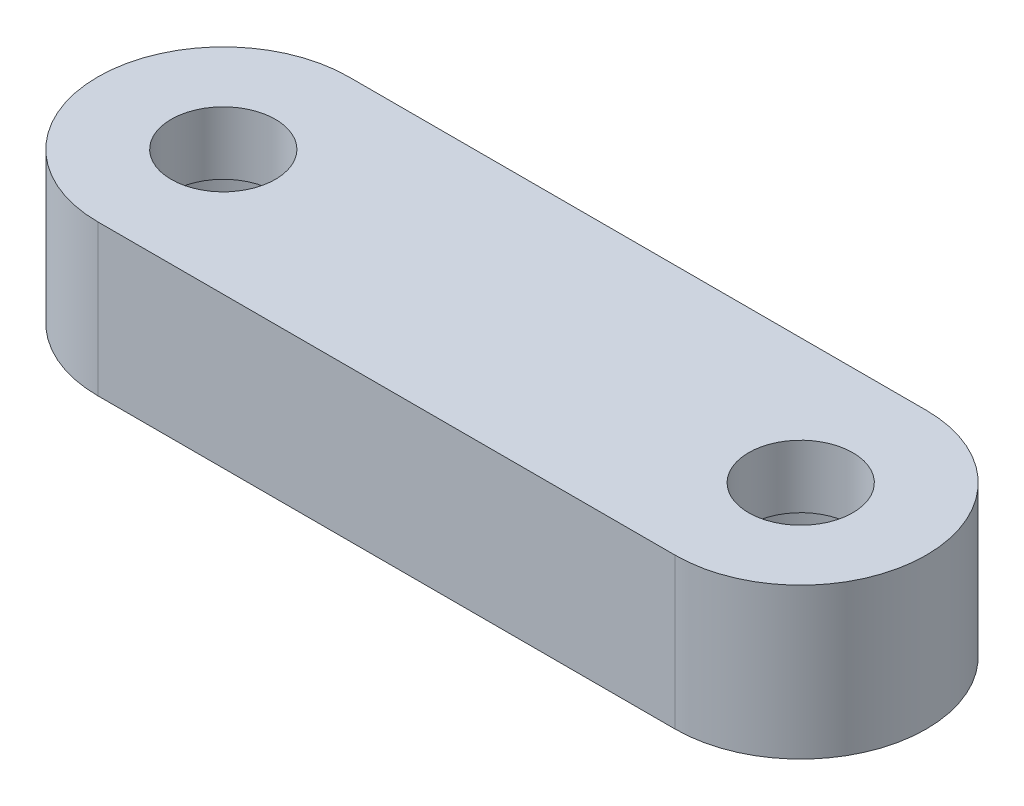
ISO-10303-21;
HEADER;
FILE_DESCRIPTION(('STEP AP214'),'2;1');
FILE_NAME('part.step','',(''),(''),'','','');
FILE_SCHEMA(('AUTOMOTIVE_DESIGN { 1 0 10303 214 1 1 1 1 }'));
ENDSEC;
DATA;
#1=APPLICATION_CONTEXT('core data for automotive mechanical design processes');
#2=APPLICATION_PROTOCOL_DEFINITION('international standard','automotive_design',2000,#1);
#3=PRODUCT_CONTEXT('',#1,'mechanical');
#4=PRODUCT('Part','Part','',(#3));
#5=PRODUCT_RELATED_PRODUCT_CATEGORY('part','',(#4));
#6=PRODUCT_DEFINITION_FORMATION('','',#4);
#7=PRODUCT_DEFINITION_CONTEXT('part definition',#1,'design');
#8=PRODUCT_DEFINITION('design','',#6,#7);
#9=PRODUCT_DEFINITION_SHAPE('','',#8);
#10=(LENGTH_UNIT() NAMED_UNIT(*) SI_UNIT(.MILLI.,.METRE.));
#11=(NAMED_UNIT(*) PLANE_ANGLE_UNIT() SI_UNIT($,.RADIAN.));
#12=(NAMED_UNIT(*) SI_UNIT($,.STERADIAN.) SOLID_ANGLE_UNIT());
#13=UNCERTAINTY_MEASURE_WITH_UNIT(LENGTH_MEASURE(1.E-05),#10,'distance_accuracy_value','');
#14=(GEOMETRIC_REPRESENTATION_CONTEXT(3) GLOBAL_UNCERTAINTY_ASSIGNED_CONTEXT((#13)) GLOBAL_UNIT_ASSIGNED_CONTEXT((#10,
#11,#12)) REPRESENTATION_CONTEXT('',''));
#15=CARTESIAN_POINT('',(0.,0.,0.));
#16=DIRECTION('',(0.,0.,1.));
#17=DIRECTION('',(1.,0.,0.));
#18=AXIS2_PLACEMENT_3D('',#15,#16,#17);
#19=CARTESIAN_POINT('',(0.,6.,0.));
#20=DIRECTION('',(0.,-1.,0.));
#21=DIRECTION('',(0.,0.,-1.));
#22=AXIS2_PLACEMENT_3D('',#19,#20,#21);
#23=CYLINDRICAL_SURFACE('',#22,5.);
#24=CARTESIAN_POINT('',(0.,0.,0.));
#25=DIRECTION('',(0.,1.,0.));
#26=DIRECTION('',(0.,0.,1.));
#27=AXIS2_PLACEMENT_3D('',#24,#25,#26);
#28=CIRCLE('',#27,5.);
#29=CARTESIAN_POINT('',(0.,0.,-5.));
#30=VERTEX_POINT('',#29);
#31=CARTESIAN_POINT('',(0.,0.,5.));
#32=VERTEX_POINT('',#31);
#33=EDGE_CURVE('E98',#30,#32,#28,.T.);
#34=ORIENTED_EDGE('',*,*,#33,.T.);
#35=DIRECTION('',(0.,-1.,0.));
#36=VECTOR('',#35,1.);
#37=CARTESIAN_POINT('',(0.,6.,5.));
#38=LINE('',#37,#36);
#39=CARTESIAN_POINT('',(0.,6.,5.));
#40=VERTEX_POINT('',#39);
#41=EDGE_CURVE('E11',#40,#32,#38,.T.);
#42=ORIENTED_EDGE('',*,*,#41,.F.);
#43=CARTESIAN_POINT('',(0.,6.,0.));
#44=DIRECTION('',(0.,1.,0.));
#45=DIRECTION('',(0.,0.,1.));
#46=AXIS2_PLACEMENT_3D('',#43,#44,#45);
#47=CIRCLE('',#46,5.);
#48=CARTESIAN_POINT('',(0.,6.,-5.));
#49=VERTEX_POINT('',#48);
#50=EDGE_CURVE('E86',#49,#40,#47,.T.);
#51=ORIENTED_EDGE('',*,*,#50,.F.);
#52=DIRECTION('',(0.,-1.,0.));
#53=VECTOR('',#52,1.);
#54=CARTESIAN_POINT('',(0.,6.,-5.));
#55=LINE('',#54,#53);
#56=EDGE_CURVE('E94',#49,#30,#55,.T.);
#57=ORIENTED_EDGE('',*,*,#56,.T.);
#58=EDGE_LOOP('',(#34,#42,#51,#57));
#59=FACE_BOUND('',#58,.T.);
#60=ADVANCED_FACE('F35',(#59),#23,.T.);
#61=CARTESIAN_POINT('',(0.,6.,5.));
#62=DIRECTION('',(0.,0.,-1.));
#63=DIRECTION('',(-1.,0.,0.));
#64=AXIS2_PLACEMENT_3D('',#61,#62,#63);
#65=PLANE('',#64);
#66=DIRECTION('',(1.,0.,0.));
#67=VECTOR('',#66,1.);
#68=CARTESIAN_POINT('',(0.,0.,5.));
#69=LINE('',#68,#67);
#70=CARTESIAN_POINT('',(23.,0.,5.));
#71=VERTEX_POINT('',#70);
#72=EDGE_CURVE('E90',#32,#71,#69,.T.);
#73=ORIENTED_EDGE('',*,*,#72,.T.);
#74=DIRECTION('',(0.,-1.,0.));
#75=VECTOR('',#74,1.);
#76=CARTESIAN_POINT('',(23.,6.,5.));
#77=LINE('',#76,#75);
#78=CARTESIAN_POINT('',(23.,6.,5.));
#79=VERTEX_POINT('',#78);
#80=EDGE_CURVE('E43',#79,#71,#77,.T.);
#81=ORIENTED_EDGE('',*,*,#80,.F.);
#82=DIRECTION('',(1.,0.,0.));
#83=VECTOR('',#82,1.);
#84=CARTESIAN_POINT('',(0.,6.,5.));
#85=LINE('',#84,#83);
#86=EDGE_CURVE('E81',#40,#79,#85,.T.);
#87=ORIENTED_EDGE('',*,*,#86,.F.);
#88=ORIENTED_EDGE('',*,*,#41,.T.);
#89=EDGE_LOOP('',(#73,#81,#87,#88));
#90=FACE_BOUND('',#89,.T.);
#91=ADVANCED_FACE('F89',(#90),#65,.F.);
#92=CARTESIAN_POINT('',(23.,6.,0.));
#93=DIRECTION('',(0.,-1.,0.));
#94=DIRECTION('',(0.,0.,-1.));
#95=AXIS2_PLACEMENT_3D('',#92,#93,#94);
#96=CYLINDRICAL_SURFACE('',#95,5.);
#97=CARTESIAN_POINT('',(23.,0.,0.));
#98=DIRECTION('',(0.,1.,0.));
#99=DIRECTION('',(0.,0.,1.));
#100=AXIS2_PLACEMENT_3D('',#97,#98,#99);
#101=CIRCLE('',#100,5.);
#102=CARTESIAN_POINT('',(23.,0.,-5.));
#103=VERTEX_POINT('',#102);
#104=EDGE_CURVE('E68',#71,#103,#101,.T.);
#105=ORIENTED_EDGE('',*,*,#104,.T.);
#106=DIRECTION('',(0.,-1.,0.));
#107=VECTOR('',#106,1.);
#108=CARTESIAN_POINT('',(23.,6.,-5.));
#109=LINE('',#108,#107);
#110=CARTESIAN_POINT('',(23.,6.,-5.));
#111=VERTEX_POINT('',#110);
#112=EDGE_CURVE('E91',#111,#103,#109,.T.);
#113=ORIENTED_EDGE('',*,*,#112,.F.);
#114=CARTESIAN_POINT('',(23.,6.,0.));
#115=DIRECTION('',(0.,1.,0.));
#116=DIRECTION('',(0.,0.,1.));
#117=AXIS2_PLACEMENT_3D('',#114,#115,#116);
#118=CIRCLE('',#117,5.);
#119=EDGE_CURVE('E84',#79,#111,#118,.T.);
#120=ORIENTED_EDGE('',*,*,#119,.F.);
#121=ORIENTED_EDGE('',*,*,#80,.T.);
#122=EDGE_LOOP('',(#105,#113,#120,#121));
#123=FACE_BOUND('',#122,.T.);
#124=ADVANCED_FACE('F92',(#123),#96,.T.);
#125=CARTESIAN_POINT('',(0.,6.,-5.));
#126=DIRECTION('',(0.,0.,1.));
#127=DIRECTION('',(1.,0.,0.));
#128=AXIS2_PLACEMENT_3D('',#125,#126,#127);
#129=PLANE('',#128);
#130=DIRECTION('',(-1.,0.,0.));
#131=VECTOR('',#130,1.);
#132=CARTESIAN_POINT('',(0.,0.,-5.));
#133=LINE('',#132,#131);
#134=EDGE_CURVE('E74',#103,#30,#133,.T.);
#135=ORIENTED_EDGE('',*,*,#134,.T.);
#136=ORIENTED_EDGE('',*,*,#56,.F.);
#137=DIRECTION('',(-1.,0.,0.));
#138=VECTOR('',#137,1.);
#139=CARTESIAN_POINT('',(0.,6.,-5.));
#140=LINE('',#139,#138);
#141=EDGE_CURVE('E51',#111,#49,#140,.T.);
#142=ORIENTED_EDGE('',*,*,#141,.F.);
#143=ORIENTED_EDGE('',*,*,#112,.T.);
#144=EDGE_LOOP('',(#135,#136,#142,#143));
#145=FACE_BOUND('',#144,.T.);
#146=ADVANCED_FACE('F106',(#145),#129,.F.);
#147=CARTESIAN_POINT('',(0.,6.,0.));
#148=DIRECTION('',(0.,1.,0.));
#149=DIRECTION('',(0.,0.,1.));
#150=AXIS2_PLACEMENT_3D('',#147,#148,#149);
#151=PLANE('',#150);
#152=CARTESIAN_POINT('',(23.,6.,0.));
#153=DIRECTION('',(0.,-1.,0.));
#154=DIRECTION('',(0.,0.,-1.));
#155=AXIS2_PLACEMENT_3D('',#152,#153,#154);
#156=CIRCLE('',#155,2.075);
#157=CARTESIAN_POINT('',(23.,6.,-2.075));
#158=VERTEX_POINT('',#157);
#159=EDGE_CURVE('E132',#158,#158,#156,.T.);
#160=ORIENTED_EDGE('',*,*,#159,.T.);
#161=EDGE_LOOP('',(#160));
#162=FACE_BOUND('',#161,.T.);
#163=CARTESIAN_POINT('',(0.,6.,0.));
#164=DIRECTION('',(0.,1.,0.));
#165=DIRECTION('',(0.,0.,1.));
#166=AXIS2_PLACEMENT_3D('',#163,#164,#165);
#167=CIRCLE('',#166,2.075);
#168=CARTESIAN_POINT('',(0.,6.,2.075));
#169=VERTEX_POINT('',#168);
#170=EDGE_CURVE('E120',#169,#169,#167,.T.);
#171=ORIENTED_EDGE('',*,*,#170,.F.);
#172=EDGE_LOOP('',(#171));
#173=FACE_BOUND('',#172,.T.);
#174=ORIENTED_EDGE('',*,*,#50,.T.);
#175=ORIENTED_EDGE('',*,*,#86,.T.);
#176=ORIENTED_EDGE('',*,*,#119,.T.);
#177=ORIENTED_EDGE('',*,*,#141,.T.);
#178=EDGE_LOOP('',(#174,#175,#176,#177));
#179=FACE_BOUND('',#178,.T.);
#180=ADVANCED_FACE('F82',(#162,#173,#179),#151,.T.);
#181=CARTESIAN_POINT('',(0.,0.,0.));
#182=DIRECTION('',(0.,1.,0.));
#183=DIRECTION('',(0.,0.,1.));
#184=AXIS2_PLACEMENT_3D('',#181,#182,#183);
#185=PLANE('',#184);
#186=CARTESIAN_POINT('',(23.,0.,0.));
#187=DIRECTION('',(0.,-1.,0.));
#188=DIRECTION('',(0.,0.,-1.));
#189=AXIS2_PLACEMENT_3D('',#186,#187,#188);
#190=CIRCLE('',#189,3.75);
#191=CARTESIAN_POINT('',(23.,0.,-3.75));
#192=VERTEX_POINT('',#191);
#193=EDGE_CURVE('E123',#192,#192,#190,.T.);
#194=ORIENTED_EDGE('',*,*,#193,.F.);
#195=EDGE_LOOP('',(#194));
#196=FACE_BOUND('',#195,.T.);
#197=CARTESIAN_POINT('',(0.,0.,0.));
#198=DIRECTION('',(0.,1.,0.));
#199=DIRECTION('',(0.,0.,1.));
#200=AXIS2_PLACEMENT_3D('',#197,#198,#199);
#201=CIRCLE('',#200,3.75);
#202=CARTESIAN_POINT('',(0.,0.,3.75));
#203=VERTEX_POINT('',#202);
#204=EDGE_CURVE('E101',#203,#203,#201,.T.);
#205=ORIENTED_EDGE('',*,*,#204,.T.);
#206=EDGE_LOOP('',(#205));
#207=FACE_BOUND('',#206,.T.);
#208=ORIENTED_EDGE('',*,*,#33,.F.);
#209=ORIENTED_EDGE('',*,*,#134,.F.);
#210=ORIENTED_EDGE('',*,*,#104,.F.);
#211=ORIENTED_EDGE('',*,*,#72,.F.);
#212=EDGE_LOOP('',(#208,#209,#210,#211));
#213=FACE_BOUND('',#212,.T.);
#214=ADVANCED_FACE('F109',(#196,#207,#213),#185,.F.);
#215=CARTESIAN_POINT('',(0.,6.,0.));
#216=DIRECTION('',(0.,1.,0.));
#217=DIRECTION('',(0.,0.,1.));
#218=AXIS2_PLACEMENT_3D('',#215,#216,#217);
#219=CYLINDRICAL_SURFACE('',#218,3.75);
#220=ORIENTED_EDGE('',*,*,#204,.F.);
#221=EDGE_LOOP('',(#220));
#222=FACE_BOUND('',#221,.T.);
#223=CARTESIAN_POINT('',(0.,3.5,0.));
#224=DIRECTION('',(0.,1.,0.));
#225=DIRECTION('',(0.,0.,1.));
#226=AXIS2_PLACEMENT_3D('',#223,#224,#225);
#227=CIRCLE('',#226,3.75);
#228=CARTESIAN_POINT('',(0.,3.5,3.75));
#229=VERTEX_POINT('',#228);
#230=EDGE_CURVE('E114',#229,#229,#227,.T.);
#231=ORIENTED_EDGE('',*,*,#230,.T.);
#232=EDGE_LOOP('',(#231));
#233=FACE_BOUND('',#232,.T.);
#234=ADVANCED_FACE('F162',(#222,#233),#219,.F.);
#235=CARTESIAN_POINT('',(-3.75,3.5,0.));
#236=DIRECTION('',(0.,1.,0.));
#237=DIRECTION('',(0.,0.,1.));
#238=AXIS2_PLACEMENT_3D('',#235,#236,#237);
#239=PLANE('',#238);
#240=ORIENTED_EDGE('',*,*,#230,.F.);
#241=EDGE_LOOP('',(#240));
#242=FACE_BOUND('',#241,.T.);
#243=CARTESIAN_POINT('',(0.,3.5,0.));
#244=DIRECTION('',(0.,1.,0.));
#245=DIRECTION('',(0.,0.,1.));
#246=AXIS2_PLACEMENT_3D('',#243,#244,#245);
#247=CIRCLE('',#246,2.075);
#248=CARTESIAN_POINT('',(0.,3.5,2.075));
#249=VERTEX_POINT('',#248);
#250=EDGE_CURVE('E117',#249,#249,#247,.T.);
#251=ORIENTED_EDGE('',*,*,#250,.T.);
#252=EDGE_LOOP('',(#251));
#253=FACE_BOUND('',#252,.T.);
#254=ADVANCED_FACE('F168',(#242,#253),#239,.F.);
#255=CARTESIAN_POINT('',(0.,6.,0.));
#256=DIRECTION('',(0.,1.,0.));
#257=DIRECTION('',(0.,0.,1.));
#258=AXIS2_PLACEMENT_3D('',#255,#256,#257);
#259=CYLINDRICAL_SURFACE('',#258,2.075);
#260=ORIENTED_EDGE('',*,*,#250,.F.);
#261=EDGE_LOOP('',(#260));
#262=FACE_BOUND('',#261,.T.);
#263=ORIENTED_EDGE('',*,*,#170,.T.);
#264=EDGE_LOOP('',(#263));
#265=FACE_BOUND('',#264,.T.);
#266=ADVANCED_FACE('F172',(#262,#265),#259,.F.);
#267=CARTESIAN_POINT('',(23.,0.,0.));
#268=DIRECTION('',(0.,-1.,0.));
#269=DIRECTION('',(0.,0.,-1.));
#270=AXIS2_PLACEMENT_3D('',#267,#268,#269);
#271=CYLINDRICAL_SURFACE('',#270,3.75);
#272=ORIENTED_EDGE('',*,*,#193,.T.);
#273=EDGE_LOOP('',(#272));
#274=FACE_BOUND('',#273,.T.);
#275=CARTESIAN_POINT('',(23.,3.5,0.));
#276=DIRECTION('',(0.,-1.,0.));
#277=DIRECTION('',(0.,0.,-1.));
#278=AXIS2_PLACEMENT_3D('',#275,#276,#277);
#279=CIRCLE('',#278,3.75);
#280=CARTESIAN_POINT('',(23.,3.5,-3.75));
#281=VERTEX_POINT('',#280);
#282=EDGE_CURVE('E126',#281,#281,#279,.T.);
#283=ORIENTED_EDGE('',*,*,#282,.F.);
#284=EDGE_LOOP('',(#283));
#285=FACE_BOUND('',#284,.T.);
#286=ADVANCED_FACE('F146',(#274,#285),#271,.F.);
#287=CARTESIAN_POINT('',(19.25,3.5,0.));
#288=DIRECTION('',(0.,-1.,0.));
#289=DIRECTION('',(0.,0.,-1.));
#290=AXIS2_PLACEMENT_3D('',#287,#288,#289);
#291=PLANE('',#290);
#292=ORIENTED_EDGE('',*,*,#282,.T.);
#293=EDGE_LOOP('',(#292));
#294=FACE_BOUND('',#293,.T.);
#295=CARTESIAN_POINT('',(23.,3.5,0.));
#296=DIRECTION('',(0.,-1.,0.));
#297=DIRECTION('',(0.,0.,-1.));
#298=AXIS2_PLACEMENT_3D('',#295,#296,#297);
#299=CIRCLE('',#298,2.075);
#300=CARTESIAN_POINT('',(23.,3.5,-2.075));
#301=VERTEX_POINT('',#300);
#302=EDGE_CURVE('E129',#301,#301,#299,.T.);
#303=ORIENTED_EDGE('',*,*,#302,.F.);
#304=EDGE_LOOP('',(#303));
#305=FACE_BOUND('',#304,.T.);
#306=ADVANCED_FACE('F140',(#294,#305),#291,.T.);
#307=CARTESIAN_POINT('',(23.,0.,0.));
#308=DIRECTION('',(0.,-1.,0.));
#309=DIRECTION('',(0.,0.,-1.));
#310=AXIS2_PLACEMENT_3D('',#307,#308,#309);
#311=CYLINDRICAL_SURFACE('',#310,2.075);
#312=ORIENTED_EDGE('',*,*,#302,.T.);
#313=EDGE_LOOP('',(#312));
#314=FACE_BOUND('',#313,.T.);
#315=ORIENTED_EDGE('',*,*,#159,.F.);
#316=EDGE_LOOP('',(#315));
#317=FACE_BOUND('',#316,.T.);
#318=ADVANCED_FACE('F138',(#314,#317),#311,.F.);
#319=CLOSED_SHELL('',(#60,#91,#124,#146,#180,#214,#234,#254,#266,#286,#306,#318));
#320=MANIFOLD_SOLID_BREP('B2',#319);
#321=ADVANCED_BREP_SHAPE_REPRESENTATION('',(#18,#320),#14);
#322=SHAPE_DEFINITION_REPRESENTATION(#9,#321);
ENDSEC;
END-ISO-10303-21;
